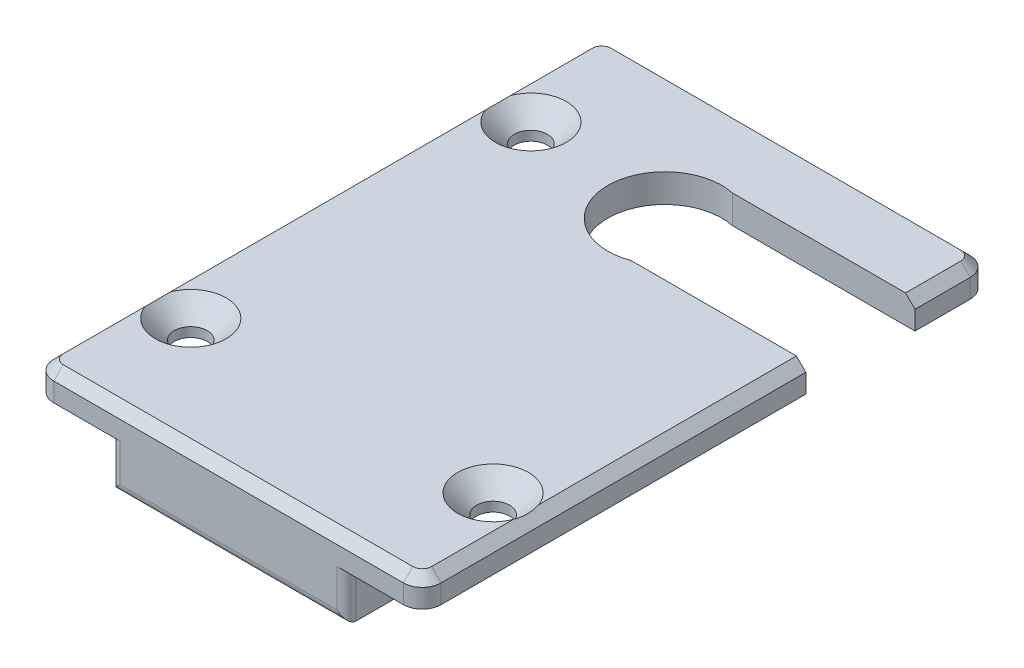
ISO-10303-21;
HEADER;
FILE_DESCRIPTION(('STEP AP214'),'2;1');
FILE_NAME('part.step','',(''),(''),'','','');
FILE_SCHEMA(('AUTOMOTIVE_DESIGN { 1 0 10303 214 1 1 1 1 }'));
ENDSEC;
DATA;
#1=APPLICATION_CONTEXT('core data for automotive mechanical design processes');
#2=APPLICATION_PROTOCOL_DEFINITION('international standard','automotive_design',2000,#1);
#3=PRODUCT_CONTEXT('',#1,'mechanical');
#4=PRODUCT('Part','Part','',(#3));
#5=PRODUCT_RELATED_PRODUCT_CATEGORY('part','',(#4));
#6=PRODUCT_DEFINITION_FORMATION('','',#4);
#7=PRODUCT_DEFINITION_CONTEXT('part definition',#1,'design');
#8=PRODUCT_DEFINITION('design','',#6,#7);
#9=PRODUCT_DEFINITION_SHAPE('','',#8);
#10=(LENGTH_UNIT() NAMED_UNIT(*) SI_UNIT(.MILLI.,.METRE.));
#11=(NAMED_UNIT(*) PLANE_ANGLE_UNIT() SI_UNIT($,.RADIAN.));
#12=(NAMED_UNIT(*) SI_UNIT($,.STERADIAN.) SOLID_ANGLE_UNIT());
#13=UNCERTAINTY_MEASURE_WITH_UNIT(LENGTH_MEASURE(1.E-05),#10,'distance_accuracy_value','');
#14=(GEOMETRIC_REPRESENTATION_CONTEXT(3) GLOBAL_UNCERTAINTY_ASSIGNED_CONTEXT((#13)) GLOBAL_UNIT_ASSIGNED_CONTEXT((#10,
#11,#12)) REPRESENTATION_CONTEXT('',''));
#15=CARTESIAN_POINT('',(0.,0.,0.));
#16=DIRECTION('',(0.,0.,1.));
#17=DIRECTION('',(1.,0.,0.));
#18=AXIS2_PLACEMENT_3D('',#15,#16,#17);
#19=CARTESIAN_POINT('',(20.5,3.,30.));
#20=DIRECTION('',(-1.,0.,0.));
#21=DIRECTION('',(0.,0.,1.));
#22=AXIS2_PLACEMENT_3D('',#19,#20,#21);
#23=PLANE('',#22);
#24=DIRECTION('',(0.,0.,-1.));
#25=VECTOR('',#24,1.);
#26=CARTESIAN_POINT('',(20.5,0.,30.));
#27=LINE('',#26,#25);
#28=CARTESIAN_POINT('',(20.5,0.,28.));
#29=VERTEX_POINT('',#28);
#30=CARTESIAN_POINT('',(20.5,0.,-10.6016995799924));
#31=VERTEX_POINT('',#30);
#32=EDGE_CURVE('E302',#29,#31,#27,.T.);
#33=ORIENTED_EDGE('',*,*,#32,.T.);
#34=DIRECTION('',(0.,1.,0.));
#35=VECTOR('',#34,1.);
#36=CARTESIAN_POINT('',(20.5,3.,-10.6016995799924));
#37=LINE('',#36,#35);
#38=CARTESIAN_POINT('',(20.5,1.99999999999999,-10.6016995799924));
#39=VERTEX_POINT('',#38);
#40=EDGE_CURVE('E251',#31,#39,#37,.T.);
#41=ORIENTED_EDGE('',*,*,#40,.T.);
#42=DIRECTION('',(0.,0.,1.));
#43=VECTOR('',#42,1.);
#44=CARTESIAN_POINT('',(20.5,1.99999999999999,30.));
#45=LINE('',#44,#43);
#46=CARTESIAN_POINT('',(20.5,1.99999999999999,28.));
#47=VERTEX_POINT('',#46);
#48=EDGE_CURVE('E448',#39,#47,#45,.T.);
#49=ORIENTED_EDGE('',*,*,#48,.T.);
#50=DIRECTION('',(0.,-1.,0.));
#51=VECTOR('',#50,1.);
#52=CARTESIAN_POINT('',(20.5,3.,28.));
#53=LINE('',#52,#51);
#54=EDGE_CURVE('E339',#47,#29,#53,.T.);
#55=ORIENTED_EDGE('',*,*,#54,.T.);
#56=EDGE_LOOP('',(#33,#41,#49,#55));
#57=FACE_BOUND('',#56,.T.);
#58=ADVANCED_FACE('F41',(#57),#23,.F.);
#59=CARTESIAN_POINT('',(19.5,3.,0.));
#60=DIRECTION('',(-0.70710678118655,-0.707106781186545,0.));
#61=DIRECTION('',(0.,0.,-1.));
#62=AXIS2_PLACEMENT_3D('',#59,#60,#61);
#63=PLANE('',#62);
#64=DIRECTION('',(-0.707106781186545,0.70710678118655,0.));
#65=VECTOR('',#64,1.);
#66=CARTESIAN_POINT('',(19.5,3.,-10.6016995799924));
#67=LINE('',#66,#65);
#68=CARTESIAN_POINT('',(19.5,3.,-10.6016995799924));
#69=VERTEX_POINT('',#68);
#70=EDGE_CURVE('E52',#69,#39,#67,.F.);
#71=ORIENTED_EDGE('',*,*,#70,.F.);
#72=DIRECTION('',(0.,0.,-1.));
#73=VECTOR('',#72,1.);
#74=CARTESIAN_POINT('',(19.5,3.,0.));
#75=LINE('',#74,#73);
#76=CARTESIAN_POINT('',(19.5,3.,16.6537087982164));
#77=VERTEX_POINT('',#76);
#78=EDGE_CURVE('E401',#77,#69,#75,.T.);
#79=ORIENTED_EDGE('',*,*,#78,.F.);
#80=CARTESIAN_POINT('',(19.5,3.,16.6537087982164));
#81=CARTESIAN_POINT('',(19.5136395829137,2.98636041708632,16.7271557247768));
#82=CARTESIAN_POINT('',(19.5262319038294,2.9737680961706,16.8009847575149));
#83=CARTESIAN_POINT('',(19.5492470662032,2.95075293379682,16.9493241816484));
#84=CARTESIAN_POINT('',(19.5596696628604,2.94033033713958,17.0238346489383));
#85=CARTESIAN_POINT('',(19.5875719343792,2.91242806562079,17.2482855541465));
#86=CARTESIAN_POINT('',(19.6016774869704,2.89832251302957,17.3990995671171));
#87=CARTESIAN_POINT('',(19.620246658516,2.87975334148401,17.698564488858));
#88=CARTESIAN_POINT('',(19.6249145973038,2.87508540269624,17.8471904738007));
#89=CARTESIAN_POINT('',(19.6250829605765,2.87491703942347,18.1443923528261));
#90=CARTESIAN_POINT('',(19.6205886391022,2.8794113608978,18.2929682267787));
#91=CARTESIAN_POINT('',(19.6069708195754,2.8930291804246,18.5169258839211));
#92=CARTESIAN_POINT('',(19.6011644134379,2.89883558656207,18.5927412381178));
#93=CARTESIAN_POINT('',(19.5872252455234,2.91277475447664,18.7439337010953));
#94=CARTESIAN_POINT('',(19.5790928010897,2.92090719891032,18.8193108682281));
#95=CARTESIAN_POINT('',(19.5510921202727,2.94890787972734,19.0463221433284));
#96=CARTESIAN_POINT('',(19.5277272002364,2.97227279976361,19.1971114573755));
#97=CARTESIAN_POINT('',(19.5,3.,19.3462912017836));
#98=B_SPLINE_CURVE_WITH_KNOTS('',3,(#80,#81,#82,#83,#84,#85,#86,#87,#88,#89,#90,#91,#92,#93,#94,
#95,#96,#97),.UNSPECIFIED.,.F.,.F.,(4,2,2,2,2,2,2,2,4),(0.,0.227782292764961,0.455590271332598,
0.911348314212516,1.3571289603666,1.80265404831174,2.03136826305219,2.26005128898759,
2.72259270099148),.UNSPECIFIED.);
#99=CARTESIAN_POINT('',(19.5,3.,19.3462912017836));
#100=VERTEX_POINT('',#99);
#101=EDGE_CURVE('E66',#77,#100,#98,.T.);
#102=ORIENTED_EDGE('',*,*,#101,.T.);
#103=CARTESIAN_POINT('',(19.5,3.,28.));
#104=VERTEX_POINT('',#103);
#105=EDGE_CURVE('E396',#104,#100,#75,.T.);
#106=ORIENTED_EDGE('',*,*,#105,.F.);
#107=DIRECTION('',(0.707106781186545,-0.70710678118655,0.));
#108=VECTOR('',#107,1.);
#109=CARTESIAN_POINT('',(19.5,3.,28.));
#110=LINE('',#109,#108);
#111=EDGE_CURVE('E471',#104,#47,#110,.T.);
#112=ORIENTED_EDGE('',*,*,#111,.T.);
#113=ORIENTED_EDGE('',*,*,#48,.F.);
#114=EDGE_LOOP('',(#71,#79,#102,#106,#112,#113));
#115=FACE_BOUND('',#114,.T.);
#116=ADVANCED_FACE('F534',(#115),#63,.F.);
#117=CARTESIAN_POINT('',(20.5,1.99999999999999,-28.));
#118=VERTEX_POINT('',#117);
#119=CARTESIAN_POINT('',(20.5,1.99999999999999,-22.1574926307751));
#120=VERTEX_POINT('',#119);
#121=EDGE_CURVE('E449',#118,#120,#45,.T.);
#122=ORIENTED_EDGE('',*,*,#121,.T.);
#123=DIRECTION('',(0.,-1.,0.));
#124=VECTOR('',#123,1.);
#125=CARTESIAN_POINT('',(20.5,3.,-22.1574926307751));
#126=LINE('',#125,#124);
#127=CARTESIAN_POINT('',(20.5,0.,-22.1574926307751));
#128=VERTEX_POINT('',#127);
#129=EDGE_CURVE('E59',#120,#128,#126,.T.);
#130=ORIENTED_EDGE('',*,*,#129,.T.);
#131=CARTESIAN_POINT('',(20.5,0.,-28.));
#132=VERTEX_POINT('',#131);
#133=EDGE_CURVE('E294',#128,#132,#27,.T.);
#134=ORIENTED_EDGE('',*,*,#133,.T.);
#135=DIRECTION('',(0.,-1.,0.));
#136=VECTOR('',#135,1.);
#137=CARTESIAN_POINT('',(20.5,3.,-28.));
#138=LINE('',#137,#136);
#139=EDGE_CURVE('E342',#132,#118,#138,.F.);
#140=ORIENTED_EDGE('',*,*,#139,.T.);
#141=EDGE_LOOP('',(#122,#130,#134,#140));
#142=FACE_BOUND('',#141,.T.);
#143=ADVANCED_FACE('F582',(#142),#23,.F.);
#144=CARTESIAN_POINT('',(-20.5,3.,-30.));
#145=DIRECTION('',(0.,0.,1.));
#146=DIRECTION('',(1.,0.,0.));
#147=AXIS2_PLACEMENT_3D('',#144,#145,#146);
#148=PLANE('',#147);
#149=DIRECTION('',(0.,-1.,0.));
#150=VECTOR('',#149,1.);
#151=CARTESIAN_POINT('',(-18.5,3.,-30.));
#152=LINE('',#151,#150);
#153=CARTESIAN_POINT('',(-18.5,0.,-30.));
#154=VERTEX_POINT('',#153);
#155=CARTESIAN_POINT('',(-18.5,1.99999999999999,-30.));
#156=VERTEX_POINT('',#155);
#157=EDGE_CURVE('E318',#154,#156,#152,.F.);
#158=ORIENTED_EDGE('',*,*,#157,.T.);
#159=DIRECTION('',(1.,0.,0.));
#160=VECTOR('',#159,1.);
#161=CARTESIAN_POINT('',(-20.5,2.00000000000001,-30.));
#162=LINE('',#161,#160);
#163=CARTESIAN_POINT('',(18.5,1.99999999999999,-30.));
#164=VERTEX_POINT('',#163);
#165=EDGE_CURVE('E426',#156,#164,#162,.T.);
#166=ORIENTED_EDGE('',*,*,#165,.T.);
#167=DIRECTION('',(0.,-1.,0.));
#168=VECTOR('',#167,1.);
#169=CARTESIAN_POINT('',(18.5,3.,-30.));
#170=LINE('',#169,#168);
#171=CARTESIAN_POINT('',(18.5,0.,-30.));
#172=VERTEX_POINT('',#171);
#173=EDGE_CURVE('E322',#164,#172,#170,.T.);
#174=ORIENTED_EDGE('',*,*,#173,.T.);
#175=DIRECTION('',(-1.,0.,0.));
#176=VECTOR('',#175,1.);
#177=CARTESIAN_POINT('',(-20.5,0.,-30.));
#178=LINE('',#177,#176);
#179=EDGE_CURVE('E306',#172,#154,#178,.T.);
#180=ORIENTED_EDGE('',*,*,#179,.T.);
#181=EDGE_LOOP('',(#158,#166,#174,#180));
#182=FACE_BOUND('',#181,.T.);
#183=ADVANCED_FACE('F590',(#182),#148,.F.);
#184=CARTESIAN_POINT('',(-20.5,3.,30.));
#185=DIRECTION('',(1.,0.,0.));
#186=DIRECTION('',(0.,0.,-1.));
#187=AXIS2_PLACEMENT_3D('',#184,#185,#186);
#188=PLANE('',#187);
#189=DIRECTION('',(0.,-1.,0.));
#190=VECTOR('',#189,1.);
#191=CARTESIAN_POINT('',(-20.5,3.,28.));
#192=LINE('',#191,#190);
#193=CARTESIAN_POINT('',(-20.5,0.,28.));
#194=VERTEX_POINT('',#193);
#195=CARTESIAN_POINT('',(-20.5,1.99999999999999,28.));
#196=VERTEX_POINT('',#195);
#197=EDGE_CURVE('E346',#194,#196,#192,.F.);
#198=ORIENTED_EDGE('',*,*,#197,.T.);
#199=DIRECTION('',(0.,0.,-1.));
#200=VECTOR('',#199,1.);
#201=CARTESIAN_POINT('',(-20.5,1.99999999999999,30.));
#202=LINE('',#201,#200);
#203=CARTESIAN_POINT('',(-20.5,1.99999999999999,-28.));
#204=VERTEX_POINT('',#203);
#205=EDGE_CURVE('E430',#196,#204,#202,.T.);
#206=ORIENTED_EDGE('',*,*,#205,.T.);
#207=DIRECTION('',(0.,-1.,0.));
#208=VECTOR('',#207,1.);
#209=CARTESIAN_POINT('',(-20.5,3.,-28.));
#210=LINE('',#209,#208);
#211=CARTESIAN_POINT('',(-20.5,0.,-28.));
#212=VERTEX_POINT('',#211);
#213=EDGE_CURVE('E350',#204,#212,#210,.T.);
#214=ORIENTED_EDGE('',*,*,#213,.T.);
#215=DIRECTION('',(0.,0.,1.));
#216=VECTOR('',#215,1.);
#217=CARTESIAN_POINT('',(-20.5,0.,30.));
#218=LINE('',#217,#216);
#219=EDGE_CURVE('E310',#212,#194,#218,.T.);
#220=ORIENTED_EDGE('',*,*,#219,.T.);
#221=EDGE_LOOP('',(#198,#206,#214,#220));
#222=FACE_BOUND('',#221,.T.);
#223=ADVANCED_FACE('F595',(#222),#188,.F.);
#224=CARTESIAN_POINT('',(-20.5,3.,30.));
#225=DIRECTION('',(0.,0.,-1.));
#226=DIRECTION('',(-1.,0.,0.));
#227=AXIS2_PLACEMENT_3D('',#224,#225,#226);
#228=PLANE('',#227);
#229=DIRECTION('',(0.,-1.,0.));
#230=VECTOR('',#229,1.);
#231=CARTESIAN_POINT('',(18.5,3.,30.));
#232=LINE('',#231,#230);
#233=CARTESIAN_POINT('',(18.5,0.,30.));
#234=VERTEX_POINT('',#233);
#235=CARTESIAN_POINT('',(18.5,1.99999999999999,30.));
#236=VERTEX_POINT('',#235);
#237=EDGE_CURVE('E353',#234,#236,#232,.F.);
#238=ORIENTED_EDGE('',*,*,#237,.T.);
#239=DIRECTION('',(-1.,0.,0.));
#240=VECTOR('',#239,1.);
#241=CARTESIAN_POINT('',(-20.5,1.99999999999999,30.));
#242=LINE('',#241,#240);
#243=CARTESIAN_POINT('',(-18.5,1.99999999999999,30.));
#244=VERTEX_POINT('',#243);
#245=EDGE_CURVE('E439',#236,#244,#242,.T.);
#246=ORIENTED_EDGE('',*,*,#245,.T.);
#247=DIRECTION('',(0.,-1.,0.));
#248=VECTOR('',#247,1.);
#249=CARTESIAN_POINT('',(-18.5,3.,30.));
#250=LINE('',#249,#248);
#251=CARTESIAN_POINT('',(-18.5,0.,30.));
#252=VERTEX_POINT('',#251);
#253=EDGE_CURVE('E357',#244,#252,#250,.T.);
#254=ORIENTED_EDGE('',*,*,#253,.T.);
#255=DIRECTION('',(1.,0.,0.));
#256=VECTOR('',#255,1.);
#257=CARTESIAN_POINT('',(-20.5,0.,30.));
#258=LINE('',#257,#256);
#259=CARTESIAN_POINT('',(-11.5,0.,30.));
#260=VERTEX_POINT('',#259);
#261=EDGE_CURVE('E315',#252,#260,#258,.T.);
#262=ORIENTED_EDGE('',*,*,#261,.T.);
#263=DIRECTION('',(0.,1.,0.));
#264=VECTOR('',#263,1.);
#265=CARTESIAN_POINT('',(-11.5,3.,30.));
#266=LINE('',#265,#264);
#267=CARTESIAN_POINT('',(-11.5,-4.,30.));
#268=VERTEX_POINT('',#267);
#269=EDGE_CURVE('E371',#260,#268,#266,.F.);
#270=ORIENTED_EDGE('',*,*,#269,.T.);
#271=DIRECTION('',(-1.,0.,0.));
#272=VECTOR('',#271,1.);
#273=CARTESIAN_POINT('',(-20.5,-4.,30.));
#274=LINE('',#273,#272);
#275=CARTESIAN_POINT('',(11.5,-4.,30.));
#276=VERTEX_POINT('',#275);
#277=EDGE_CURVE('E368',#268,#276,#274,.F.);
#278=ORIENTED_EDGE('',*,*,#277,.T.);
#279=DIRECTION('',(0.,1.,0.));
#280=VECTOR('',#279,1.);
#281=CARTESIAN_POINT('',(11.5,3.,30.));
#282=LINE('',#281,#280);
#283=CARTESIAN_POINT('',(11.5,0.,30.));
#284=VERTEX_POINT('',#283);
#285=EDGE_CURVE('E364',#276,#284,#282,.T.);
#286=ORIENTED_EDGE('',*,*,#285,.T.);
#287=EDGE_CURVE('E314',#284,#234,#258,.T.);
#288=ORIENTED_EDGE('',*,*,#287,.T.);
#289=EDGE_LOOP('',(#238,#246,#254,#262,#270,#278,#286,#288));
#290=FACE_BOUND('',#289,.T.);
#291=ADVANCED_FACE('F674',(#290),#228,.F.);
#292=CARTESIAN_POINT('',(0.,3.,0.));
#293=DIRECTION('',(0.,-1.,0.));
#294=DIRECTION('',(0.,0.,-1.));
#295=AXIS2_PLACEMENT_3D('',#292,#293,#294);
#296=PLANE('',#295);
#297=ORIENTED_EDGE('',*,*,#78,.T.);
#298=DIRECTION('',(1.,0.,0.));
#299=VECTOR('',#298,1.);
#300=CARTESIAN_POINT('',(23.4185968881252,3.,-10.6016995799924));
#301=LINE('',#300,#299);
#302=CARTESIAN_POINT('',(2.02351344164301,3.,-10.6016995799924));
#303=VERTEX_POINT('',#302);
#304=EDGE_CURVE('E227',#303,#69,#301,.T.);
#305=ORIENTED_EDGE('',*,*,#304,.F.);
#306=CARTESIAN_POINT('',(-0.0812731172144571,3.,-16.2575493955439));
#307=DIRECTION('',(0.,1.,0.));
#308=DIRECTION('',(0.,0.,1.));
#309=AXIS2_PLACEMENT_3D('',#306,#307,#308);
#310=CIRCLE('',#309,6.03479606900029);
#311=CARTESIAN_POINT('',(1.1873613516026,3.,-22.1574926307751));
#312=VERTEX_POINT('',#311);
#313=EDGE_CURVE('E221',#312,#303,#310,.T.);
#314=ORIENTED_EDGE('',*,*,#313,.F.);
#315=DIRECTION('',(-1.,0.,0.));
#316=VECTOR('',#315,1.);
#317=CARTESIAN_POINT('',(23.4185968881252,3.,-22.1574926307751));
#318=LINE('',#317,#316);
#319=CARTESIAN_POINT('',(19.5,3.,-22.1574926307751));
#320=VERTEX_POINT('',#319);
#321=EDGE_CURVE('E230',#320,#312,#318,.T.);
#322=ORIENTED_EDGE('',*,*,#321,.F.);
#323=CARTESIAN_POINT('',(19.5,3.,-28.));
#324=VERTEX_POINT('',#323);
#325=EDGE_CURVE('E387',#320,#324,#75,.T.);
#326=ORIENTED_EDGE('',*,*,#325,.T.);
#327=CARTESIAN_POINT('',(18.5,3.,-28.));
#328=DIRECTION('',(0.,-1.,0.));
#329=DIRECTION('',(0.,0.,-1.));
#330=AXIS2_PLACEMENT_3D('',#327,#328,#329);
#331=CIRCLE('',#330,1.);
#332=CARTESIAN_POINT('',(18.5,3.,-29.));
#333=VERTEX_POINT('',#332);
#334=EDGE_CURVE('E400',#324,#333,#331,.F.);
#335=ORIENTED_EDGE('',*,*,#334,.T.);
#336=DIRECTION('',(-1.,0.,0.));
#337=VECTOR('',#336,1.);
#338=CARTESIAN_POINT('',(0.,3.,-29.));
#339=LINE('',#338,#337);
#340=CARTESIAN_POINT('',(-18.5,3.,-29.));
#341=VERTEX_POINT('',#340);
#342=EDGE_CURVE('E418',#333,#341,#339,.T.);
#343=ORIENTED_EDGE('',*,*,#342,.T.);
#344=CARTESIAN_POINT('',(-18.5,3.,-28.));
#345=DIRECTION('',(0.,-1.,0.));
#346=DIRECTION('',(0.,0.,-1.));
#347=AXIS2_PLACEMENT_3D('',#344,#345,#346);
#348=CIRCLE('',#347,0.999999999999997);
#349=CARTESIAN_POINT('',(-19.5,3.,-28.));
#350=VERTEX_POINT('',#349);
#351=EDGE_CURVE('E423',#341,#350,#348,.F.);
#352=ORIENTED_EDGE('',*,*,#351,.T.);
#353=DIRECTION('',(0.,0.,1.));
#354=VECTOR('',#353,1.);
#355=CARTESIAN_POINT('',(-19.5,3.,0.));
#356=LINE('',#355,#354);
#357=CARTESIAN_POINT('',(-19.5,3.,-19.3462912017837));
#358=VERTEX_POINT('',#357);
#359=EDGE_CURVE('E414',#350,#358,#356,.T.);
#360=ORIENTED_EDGE('',*,*,#359,.T.);
#361=CARTESIAN_POINT('',(-16.,3.,-18.));
#362=DIRECTION('',(0.,-1.,0.));
#363=DIRECTION('',(0.,0.,-1.));
#364=AXIS2_PLACEMENT_3D('',#361,#362,#363);
#365=CIRCLE('',#364,3.75000000000002);
#366=CARTESIAN_POINT('',(-19.5,3.,-16.6537087982163));
#367=VERTEX_POINT('',#366);
#368=EDGE_CURVE('E485',#358,#367,#365,.T.);
#369=ORIENTED_EDGE('',*,*,#368,.T.);
#370=CARTESIAN_POINT('',(-19.5,3.,16.6537087982163));
#371=VERTEX_POINT('',#370);
#372=EDGE_CURVE('E419',#367,#371,#356,.T.);
#373=ORIENTED_EDGE('',*,*,#372,.T.);
#374=CARTESIAN_POINT('',(-16.,3.,18.));
#375=DIRECTION('',(0.,-1.,0.));
#376=DIRECTION('',(0.,0.,-1.));
#377=AXIS2_PLACEMENT_3D('',#374,#375,#376);
#378=CIRCLE('',#377,3.75000000000002);
#379=CARTESIAN_POINT('',(-19.5,3.,19.3462912017837));
#380=VERTEX_POINT('',#379);
#381=EDGE_CURVE('E492',#371,#380,#378,.T.);
#382=ORIENTED_EDGE('',*,*,#381,.T.);
#383=CARTESIAN_POINT('',(-19.5,3.,28.));
#384=VERTEX_POINT('',#383);
#385=EDGE_CURVE('E413',#380,#384,#356,.T.);
#386=ORIENTED_EDGE('',*,*,#385,.T.);
#387=CARTESIAN_POINT('',(-18.5,3.,28.));
#388=DIRECTION('',(0.,-1.,0.));
#389=DIRECTION('',(0.,0.,-1.));
#390=AXIS2_PLACEMENT_3D('',#387,#388,#389);
#391=CIRCLE('',#390,1.);
#392=CARTESIAN_POINT('',(-18.5,3.,29.));
#393=VERTEX_POINT('',#392);
#394=EDGE_CURVE('E410',#384,#393,#391,.F.);
#395=ORIENTED_EDGE('',*,*,#394,.T.);
#396=DIRECTION('',(1.,0.,0.));
#397=VECTOR('',#396,1.);
#398=CARTESIAN_POINT('',(0.,3.,29.));
#399=LINE('',#398,#397);
#400=CARTESIAN_POINT('',(18.5,3.,29.));
#401=VERTEX_POINT('',#400);
#402=EDGE_CURVE('E407',#393,#401,#399,.T.);
#403=ORIENTED_EDGE('',*,*,#402,.T.);
#404=CARTESIAN_POINT('',(18.5,3.,28.));
#405=DIRECTION('',(0.,-1.,0.));
#406=DIRECTION('',(0.,0.,-1.));
#407=AXIS2_PLACEMENT_3D('',#404,#405,#406);
#408=CIRCLE('',#407,0.999999999999997);
#409=EDGE_CURVE('E404',#401,#104,#408,.F.);
#410=ORIENTED_EDGE('',*,*,#409,.T.);
#411=ORIENTED_EDGE('',*,*,#105,.T.);
#412=CARTESIAN_POINT('',(16.,3.,18.));
#413=DIRECTION('',(0.,-1.,0.));
#414=DIRECTION('',(0.,0.,-1.));
#415=AXIS2_PLACEMENT_3D('',#412,#413,#414);
#416=CIRCLE('',#415,3.75000000000001);
#417=EDGE_CURVE('E489',#100,#77,#416,.T.);
#418=ORIENTED_EDGE('',*,*,#417,.T.);
#419=EDGE_LOOP('',(#297,#305,#314,#322,#326,#335,#343,#352,#360,#369,#373,#382,#386,#395,#403,
#410,#411,#418));
#420=FACE_BOUND('',#419,.T.);
#421=ADVANCED_FACE('F238',(#420),#296,.F.);
#422=CARTESIAN_POINT('',(0.,0.,0.));
#423=DIRECTION('',(0.,-1.,0.));
#424=DIRECTION('',(0.,0.,-1.));
#425=AXIS2_PLACEMENT_3D('',#422,#423,#424);
#426=PLANE('',#425);
#427=DIRECTION('',(-1.,0.,0.));
#428=VECTOR('',#427,1.);
#429=CARTESIAN_POINT('',(0.,0.,-10.6016995799924));
#430=LINE('',#429,#428);
#431=CARTESIAN_POINT('',(2.02351344164301,0.,-10.6016995799924));
#432=VERTEX_POINT('',#431);
#433=EDGE_CURVE('E255',#31,#432,#430,.T.);
#434=ORIENTED_EDGE('',*,*,#433,.F.);
#435=ORIENTED_EDGE('',*,*,#32,.F.);
#436=CARTESIAN_POINT('',(18.5,0.,28.));
#437=DIRECTION('',(0.,-1.,0.));
#438=DIRECTION('',(0.,0.,-1.));
#439=AXIS2_PLACEMENT_3D('',#436,#437,#438);
#440=CIRCLE('',#439,2.);
#441=EDGE_CURVE('E325',#29,#234,#440,.T.);
#442=ORIENTED_EDGE('',*,*,#441,.T.);
#443=ORIENTED_EDGE('',*,*,#287,.F.);
#444=CARTESIAN_POINT('',(11.5,0.,29.));
#445=DIRECTION('',(0.,-1.,0.));
#446=DIRECTION('',(0.,0.,-1.));
#447=AXIS2_PLACEMENT_3D('',#444,#445,#446);
#448=CIRCLE('',#447,1.);
#449=CARTESIAN_POINT('',(12.5,0.,29.));
#450=VERTEX_POINT('',#449);
#451=EDGE_CURVE('E384',#284,#450,#448,.F.);
#452=ORIENTED_EDGE('',*,*,#451,.T.);
#453=DIRECTION('',(0.,0.,1.));
#454=VECTOR('',#453,1.);
#455=CARTESIAN_POINT('',(12.5,0.,22.));
#456=LINE('',#455,#454);
#457=CARTESIAN_POINT('',(12.5,0.,22.));
#458=VERTEX_POINT('',#457);
#459=EDGE_CURVE('E271',#458,#450,#456,.T.);
#460=ORIENTED_EDGE('',*,*,#459,.F.);
#461=DIRECTION('',(1.,0.,0.));
#462=VECTOR('',#461,1.);
#463=CARTESIAN_POINT('',(-12.5,0.,22.));
#464=LINE('',#463,#462);
#465=CARTESIAN_POINT('',(-12.5,0.,22.));
#466=VERTEX_POINT('',#465);
#467=EDGE_CURVE('E264',#466,#458,#464,.T.);
#468=ORIENTED_EDGE('',*,*,#467,.F.);
#469=DIRECTION('',(0.,0.,-1.));
#470=VECTOR('',#469,1.);
#471=CARTESIAN_POINT('',(-12.5,0.,22.));
#472=LINE('',#471,#470);
#473=CARTESIAN_POINT('',(-12.5,0.,29.));
#474=VERTEX_POINT('',#473);
#475=EDGE_CURVE('E275',#474,#466,#472,.T.);
#476=ORIENTED_EDGE('',*,*,#475,.F.);
#477=CARTESIAN_POINT('',(-11.5,0.,29.));
#478=DIRECTION('',(0.,-1.,0.));
#479=DIRECTION('',(0.,0.,-1.));
#480=AXIS2_PLACEMENT_3D('',#477,#478,#479);
#481=CIRCLE('',#480,1.);
#482=EDGE_CURVE('E380',#474,#260,#481,.F.);
#483=ORIENTED_EDGE('',*,*,#482,.T.);
#484=ORIENTED_EDGE('',*,*,#261,.F.);
#485=CARTESIAN_POINT('',(-18.5,0.,28.));
#486=DIRECTION('',(0.,-1.,0.));
#487=DIRECTION('',(0.,0.,-1.));
#488=AXIS2_PLACEMENT_3D('',#485,#486,#487);
#489=CIRCLE('',#488,2.);
#490=EDGE_CURVE('E329',#252,#194,#489,.T.);
#491=ORIENTED_EDGE('',*,*,#490,.T.);
#492=ORIENTED_EDGE('',*,*,#219,.F.);
#493=CARTESIAN_POINT('',(-18.5,0.,-28.));
#494=DIRECTION('',(0.,-1.,0.));
#495=DIRECTION('',(0.,0.,-1.));
#496=AXIS2_PLACEMENT_3D('',#493,#494,#495);
#497=CIRCLE('',#496,2.);
#498=EDGE_CURVE('E332',#212,#154,#497,.T.);
#499=ORIENTED_EDGE('',*,*,#498,.T.);
#500=ORIENTED_EDGE('',*,*,#179,.F.);
#501=CARTESIAN_POINT('',(18.5,0.,-28.));
#502=DIRECTION('',(0.,-1.,0.));
#503=DIRECTION('',(0.,0.,-1.));
#504=AXIS2_PLACEMENT_3D('',#501,#502,#503);
#505=CIRCLE('',#504,2.);
#506=EDGE_CURVE('E335',#172,#132,#505,.T.);
#507=ORIENTED_EDGE('',*,*,#506,.T.);
#508=ORIENTED_EDGE('',*,*,#133,.F.);
#509=DIRECTION('',(1.,0.,0.));
#510=VECTOR('',#509,1.);
#511=CARTESIAN_POINT('',(0.,0.,-22.1574926307751));
#512=LINE('',#511,#510);
#513=CARTESIAN_POINT('',(1.1873613516026,0.,-22.1574926307751));
#514=VERTEX_POINT('',#513);
#515=EDGE_CURVE('E248',#514,#128,#512,.T.);
#516=ORIENTED_EDGE('',*,*,#515,.F.);
#517=CARTESIAN_POINT('',(-0.0812731172144571,0.,-16.2575493955439));
#518=DIRECTION('',(0.,-1.,0.));
#519=DIRECTION('',(0.,0.,-1.));
#520=AXIS2_PLACEMENT_3D('',#517,#518,#519);
#521=CIRCLE('',#520,6.03479606900029);
#522=EDGE_CURVE('E11',#432,#514,#521,.T.);
#523=ORIENTED_EDGE('',*,*,#522,.F.);
#524=EDGE_LOOP('',(#434,#435,#442,#443,#452,#460,#468,#476,#483,#484,#491,#492,#499,#500,#507,
#508,#516,#523));
#525=FACE_BOUND('',#524,.T.);
#526=CARTESIAN_POINT('',(-16.,0.,-18.));
#527=DIRECTION('',(0.,1.,0.));
#528=DIRECTION('',(0.,0.,-1.));
#529=AXIS2_PLACEMENT_3D('',#526,#527,#528);
#530=CIRCLE('',#529,1.75);
#531=CARTESIAN_POINT('',(-16.,0.,-19.75));
#532=VERTEX_POINT('',#531);
#533=EDGE_CURVE('E289',#532,#532,#530,.T.);
#534=ORIENTED_EDGE('',*,*,#533,.T.);
#535=EDGE_LOOP('',(#534));
#536=FACE_BOUND('',#535,.T.);
#537=CARTESIAN_POINT('',(-16.,0.,18.));
#538=DIRECTION('',(0.,1.,0.));
#539=DIRECTION('',(0.,0.,1.));
#540=AXIS2_PLACEMENT_3D('',#537,#538,#539);
#541=CIRCLE('',#540,1.75);
#542=CARTESIAN_POINT('',(-16.,0.,19.75));
#543=VERTEX_POINT('',#542);
#544=EDGE_CURVE('E295',#543,#543,#541,.T.);
#545=ORIENTED_EDGE('',*,*,#544,.T.);
#546=EDGE_LOOP('',(#545));
#547=FACE_BOUND('',#546,.T.);
#548=CARTESIAN_POINT('',(16.,0.,18.));
#549=DIRECTION('',(0.,1.,0.));
#550=DIRECTION('',(0.,0.,-1.));
#551=AXIS2_PLACEMENT_3D('',#548,#549,#550);
#552=CIRCLE('',#551,1.75);
#553=CARTESIAN_POINT('',(16.,0.,16.25));
#554=VERTEX_POINT('',#553);
#555=EDGE_CURVE('E290',#554,#554,#552,.T.);
#556=ORIENTED_EDGE('',*,*,#555,.T.);
#557=EDGE_LOOP('',(#556));
#558=FACE_BOUND('',#557,.T.);
#559=ADVANCED_FACE('F656',(#525,#536,#547,#558),#426,.T.);
#560=CARTESIAN_POINT('',(16.,0.,18.));
#561=DIRECTION('',(0.,1.,0.));
#562=DIRECTION('',(0.,0.,1.));
#563=AXIS2_PLACEMENT_3D('',#560,#561,#562);
#564=CYLINDRICAL_SURFACE('',#563,1.75);
#565=CARTESIAN_POINT('',(16.,1.,18.));
#566=DIRECTION('',(0.,-1.,0.));
#567=DIRECTION('',(0.,0.,-1.));
#568=AXIS2_PLACEMENT_3D('',#565,#566,#567);
#569=CIRCLE('',#568,1.75);
#570=CARTESIAN_POINT('',(16.,1.,16.25));
#571=VERTEX_POINT('',#570);
#572=EDGE_CURVE('E544',#571,#571,#569,.F.);
#573=ORIENTED_EDGE('',*,*,#572,.T.);
#574=EDGE_LOOP('',(#573));
#575=FACE_BOUND('',#574,.T.);
#576=ORIENTED_EDGE('',*,*,#555,.F.);
#577=EDGE_LOOP('',(#576));
#578=FACE_BOUND('',#577,.T.);
#579=ADVANCED_FACE('F685',(#575,#578),#564,.F.);
#580=CARTESIAN_POINT('',(-16.,0.,18.));
#581=DIRECTION('',(0.,1.,0.));
#582=DIRECTION('',(0.,0.,1.));
#583=AXIS2_PLACEMENT_3D('',#580,#581,#582);
#584=CYLINDRICAL_SURFACE('',#583,1.75);
#585=CARTESIAN_POINT('',(-16.,0.999999999999992,18.));
#586=DIRECTION('',(0.,-1.,0.));
#587=DIRECTION('',(0.,0.,-1.));
#588=AXIS2_PLACEMENT_3D('',#585,#586,#587);
#589=CIRCLE('',#588,1.75);
#590=CARTESIAN_POINT('',(-16.,0.999999999999992,16.25));
#591=VERTEX_POINT('',#590);
#592=EDGE_CURVE('E453',#591,#591,#589,.F.);
#593=ORIENTED_EDGE('',*,*,#592,.T.);
#594=EDGE_LOOP('',(#593));
#595=FACE_BOUND('',#594,.T.);
#596=ORIENTED_EDGE('',*,*,#544,.F.);
#597=EDGE_LOOP('',(#596));
#598=FACE_BOUND('',#597,.T.);
#599=ADVANCED_FACE('F689',(#595,#598),#584,.F.);
#600=CARTESIAN_POINT('',(-16.,0.,-18.));
#601=DIRECTION('',(0.,1.,0.));
#602=DIRECTION('',(0.,0.,1.));
#603=AXIS2_PLACEMENT_3D('',#600,#601,#602);
#604=CYLINDRICAL_SURFACE('',#603,1.75);
#605=CARTESIAN_POINT('',(-16.,0.999999999999992,-18.));
#606=DIRECTION('',(0.,-1.,0.));
#607=DIRECTION('',(0.,0.,-1.));
#608=AXIS2_PLACEMENT_3D('',#605,#606,#607);
#609=CIRCLE('',#608,1.75);
#610=CARTESIAN_POINT('',(-16.,0.999999999999992,-19.75));
#611=VERTEX_POINT('',#610);
#612=EDGE_CURVE('E543',#611,#611,#609,.F.);
#613=ORIENTED_EDGE('',*,*,#612,.T.);
#614=EDGE_LOOP('',(#613));
#615=FACE_BOUND('',#614,.T.);
#616=ORIENTED_EDGE('',*,*,#533,.F.);
#617=EDGE_LOOP('',(#616));
#618=FACE_BOUND('',#617,.T.);
#619=ADVANCED_FACE('F619',(#615,#618),#604,.F.);
#620=CARTESIAN_POINT('',(18.5,3.,-28.));
#621=DIRECTION('',(0.,-1.,0.));
#622=DIRECTION('',(0.,0.,-1.));
#623=AXIS2_PLACEMENT_3D('',#620,#621,#622);
#624=CYLINDRICAL_SURFACE('',#623,2.);
#625=ORIENTED_EDGE('',*,*,#173,.F.);
#626=CARTESIAN_POINT('',(18.5,1.99999999999999,-28.));
#627=DIRECTION('',(0.,-1.,0.));
#628=DIRECTION('',(0.,0.,-1.));
#629=AXIS2_PLACEMENT_3D('',#626,#627,#628);
#630=CIRCLE('',#629,2.);
#631=EDGE_CURVE('E445',#164,#118,#630,.T.);
#632=ORIENTED_EDGE('',*,*,#631,.T.);
#633=ORIENTED_EDGE('',*,*,#139,.F.);
#634=ORIENTED_EDGE('',*,*,#506,.F.);
#635=EDGE_LOOP('',(#625,#632,#633,#634));
#636=FACE_BOUND('',#635,.T.);
#637=ADVANCED_FACE('F782',(#636),#624,.T.);
#638=CARTESIAN_POINT('',(-18.5,3.,-28.));
#639=DIRECTION('',(0.,-1.,0.));
#640=DIRECTION('',(0.,0.,-1.));
#641=AXIS2_PLACEMENT_3D('',#638,#639,#640);
#642=CYLINDRICAL_SURFACE('',#641,2.);
#643=ORIENTED_EDGE('',*,*,#213,.F.);
#644=CARTESIAN_POINT('',(-18.5,1.99999999999999,-28.));
#645=DIRECTION('',(0.,-1.,0.));
#646=DIRECTION('',(0.,0.,-1.));
#647=AXIS2_PLACEMENT_3D('',#644,#645,#646);
#648=CIRCLE('',#647,2.);
#649=EDGE_CURVE('E436',#204,#156,#648,.T.);
#650=ORIENTED_EDGE('',*,*,#649,.T.);
#651=ORIENTED_EDGE('',*,*,#157,.F.);
#652=ORIENTED_EDGE('',*,*,#498,.F.);
#653=EDGE_LOOP('',(#643,#650,#651,#652));
#654=FACE_BOUND('',#653,.T.);
#655=ADVANCED_FACE('F650',(#654),#642,.T.);
#656=CARTESIAN_POINT('',(-18.5,3.,28.));
#657=DIRECTION('',(0.,-1.,0.));
#658=DIRECTION('',(0.,0.,-1.));
#659=AXIS2_PLACEMENT_3D('',#656,#657,#658);
#660=CYLINDRICAL_SURFACE('',#659,2.);
#661=ORIENTED_EDGE('',*,*,#253,.F.);
#662=CARTESIAN_POINT('',(-18.5,1.99999999999999,28.));
#663=DIRECTION('',(0.,-1.,0.));
#664=DIRECTION('',(0.,0.,-1.));
#665=AXIS2_PLACEMENT_3D('',#662,#663,#664);
#666=CIRCLE('',#665,2.);
#667=EDGE_CURVE('E433',#244,#196,#666,.T.);
#668=ORIENTED_EDGE('',*,*,#667,.T.);
#669=ORIENTED_EDGE('',*,*,#197,.F.);
#670=ORIENTED_EDGE('',*,*,#490,.F.);
#671=EDGE_LOOP('',(#661,#668,#669,#670));
#672=FACE_BOUND('',#671,.T.);
#673=ADVANCED_FACE('F662',(#672),#660,.T.);
#674=CARTESIAN_POINT('',(18.5,3.,28.));
#675=DIRECTION('',(0.,-1.,0.));
#676=DIRECTION('',(0.,0.,-1.));
#677=AXIS2_PLACEMENT_3D('',#674,#675,#676);
#678=CYLINDRICAL_SURFACE('',#677,2.);
#679=ORIENTED_EDGE('',*,*,#54,.F.);
#680=CARTESIAN_POINT('',(18.5,1.99999999999999,28.));
#681=DIRECTION('',(0.,-1.,0.));
#682=DIRECTION('',(0.,0.,-1.));
#683=AXIS2_PLACEMENT_3D('',#680,#681,#682);
#684=CIRCLE('',#683,2.);
#685=EDGE_CURVE('E442',#47,#236,#684,.T.);
#686=ORIENTED_EDGE('',*,*,#685,.T.);
#687=ORIENTED_EDGE('',*,*,#237,.F.);
#688=ORIENTED_EDGE('',*,*,#441,.F.);
#689=EDGE_LOOP('',(#679,#686,#687,#688));
#690=FACE_BOUND('',#689,.T.);
#691=ADVANCED_FACE('F672',(#690),#678,.T.);
#692=CARTESIAN_POINT('',(12.5,-5.,22.));
#693=DIRECTION('',(-1.,0.,0.));
#694=DIRECTION('',(0.,0.,1.));
#695=AXIS2_PLACEMENT_3D('',#692,#693,#694);
#696=PLANE('',#695);
#697=ORIENTED_EDGE('',*,*,#459,.T.);
#698=DIRECTION('',(0.,1.,0.));
#699=VECTOR('',#698,1.);
#700=CARTESIAN_POINT('',(12.5,-5.,29.));
#701=LINE('',#700,#699);
#702=CARTESIAN_POINT('',(12.5,-5.,29.));
#703=VERTEX_POINT('',#702);
#704=EDGE_CURVE('E377',#450,#703,#701,.F.);
#705=ORIENTED_EDGE('',*,*,#704,.T.);
#706=DIRECTION('',(0.,0.,1.));
#707=VECTOR('',#706,1.);
#708=CARTESIAN_POINT('',(12.5,-5.,22.));
#709=LINE('',#708,#707);
#710=CARTESIAN_POINT('',(12.5,-5.,22.));
#711=VERTEX_POINT('',#710);
#712=EDGE_CURVE('E259',#711,#703,#709,.T.);
#713=ORIENTED_EDGE('',*,*,#712,.F.);
#714=DIRECTION('',(0.,1.,0.));
#715=VECTOR('',#714,1.);
#716=CARTESIAN_POINT('',(12.5,-5.,22.));
#717=LINE('',#716,#715);
#718=EDGE_CURVE('E270',#711,#458,#717,.T.);
#719=ORIENTED_EDGE('',*,*,#718,.T.);
#720=EDGE_LOOP('',(#697,#705,#713,#719));
#721=FACE_BOUND('',#720,.T.);
#722=ADVANCED_FACE('F774',(#721),#696,.F.);
#723=CARTESIAN_POINT('',(-12.5,-5.,22.));
#724=DIRECTION('',(1.,0.,0.));
#725=DIRECTION('',(0.,0.,-1.));
#726=AXIS2_PLACEMENT_3D('',#723,#724,#725);
#727=PLANE('',#726);
#728=DIRECTION('',(0.,0.,-1.));
#729=VECTOR('',#728,1.);
#730=CARTESIAN_POINT('',(-12.5,-5.,22.));
#731=LINE('',#730,#729);
#732=CARTESIAN_POINT('',(-12.5,-5.,29.));
#733=VERTEX_POINT('',#732);
#734=CARTESIAN_POINT('',(-12.5,-5.,22.));
#735=VERTEX_POINT('',#734);
#736=EDGE_CURVE('E263',#733,#735,#731,.T.);
#737=ORIENTED_EDGE('',*,*,#736,.F.);
#738=DIRECTION('',(0.,1.,0.));
#739=VECTOR('',#738,1.);
#740=CARTESIAN_POINT('',(-12.5,-5.,29.));
#741=LINE('',#740,#739);
#742=EDGE_CURVE('E360',#733,#474,#741,.T.);
#743=ORIENTED_EDGE('',*,*,#742,.T.);
#744=ORIENTED_EDGE('',*,*,#475,.T.);
#745=DIRECTION('',(0.,1.,0.));
#746=VECTOR('',#745,1.);
#747=CARTESIAN_POINT('',(-12.5,-5.,22.));
#748=LINE('',#747,#746);
#749=EDGE_CURVE('E285',#735,#466,#748,.T.);
#750=ORIENTED_EDGE('',*,*,#749,.F.);
#751=EDGE_LOOP('',(#737,#743,#744,#750));
#752=FACE_BOUND('',#751,.T.);
#753=ADVANCED_FACE('F770',(#752),#727,.F.);
#754=CARTESIAN_POINT('',(-12.5,-5.,22.));
#755=DIRECTION('',(0.,0.,1.));
#756=DIRECTION('',(1.,0.,0.));
#757=AXIS2_PLACEMENT_3D('',#754,#755,#756);
#758=PLANE('',#757);
#759=ORIENTED_EDGE('',*,*,#467,.T.);
#760=ORIENTED_EDGE('',*,*,#718,.F.);
#761=DIRECTION('',(1.,0.,0.));
#762=VECTOR('',#761,1.);
#763=CARTESIAN_POINT('',(-12.5,-5.,22.));
#764=LINE('',#763,#762);
#765=EDGE_CURVE('E267',#735,#711,#764,.T.);
#766=ORIENTED_EDGE('',*,*,#765,.F.);
#767=ORIENTED_EDGE('',*,*,#749,.T.);
#768=EDGE_LOOP('',(#759,#760,#766,#767));
#769=FACE_BOUND('',#768,.T.);
#770=ADVANCED_FACE('F766',(#769),#758,.F.);
#771=CARTESIAN_POINT('',(0.,-5.,0.));
#772=DIRECTION('',(0.,1.,0.));
#773=DIRECTION('',(0.,0.,1.));
#774=AXIS2_PLACEMENT_3D('',#771,#772,#773);
#775=PLANE('',#774);
#776=ORIENTED_EDGE('',*,*,#712,.T.);
#777=DIRECTION('',(-1.,0.,0.));
#778=VECTOR('',#777,1.);
#779=CARTESIAN_POINT('',(0.,-5.,29.));
#780=LINE('',#779,#778);
#781=EDGE_CURVE('E374',#703,#733,#780,.T.);
#782=ORIENTED_EDGE('',*,*,#781,.T.);
#783=ORIENTED_EDGE('',*,*,#736,.T.);
#784=ORIENTED_EDGE('',*,*,#765,.T.);
#785=EDGE_LOOP('',(#776,#782,#783,#784));
#786=FACE_BOUND('',#785,.T.);
#787=ADVANCED_FACE('F762',(#786),#775,.F.);
#788=CARTESIAN_POINT('',(11.5,3.,29.));
#789=DIRECTION('',(0.,1.,0.));
#790=DIRECTION('',(0.,0.,1.));
#791=AXIS2_PLACEMENT_3D('',#788,#789,#790);
#792=CYLINDRICAL_SURFACE('',#791,1.);
#793=ORIENTED_EDGE('',*,*,#451,.F.);
#794=ORIENTED_EDGE('',*,*,#285,.F.);
#795=CARTESIAN_POINT('',(11.5,-4.,29.));
#796=DIRECTION('',(0.707106781186547,0.707106781186547,0.));
#797=DIRECTION('',(-0.707106781186547,0.707106781186547,0.));
#798=AXIS2_PLACEMENT_3D('',#795,#796,#797);
#799=ELLIPSE('',#798,1.41421356237309,1.);
#800=EDGE_CURVE('E276',#703,#276,#799,.F.);
#801=ORIENTED_EDGE('',*,*,#800,.F.);
#802=ORIENTED_EDGE('',*,*,#704,.F.);
#803=EDGE_LOOP('',(#793,#794,#801,#802));
#804=FACE_BOUND('',#803,.T.);
#805=ADVANCED_FACE('F765',(#804),#792,.T.);
#806=CARTESIAN_POINT('',(0.,-4.,29.));
#807=DIRECTION('',(-1.,0.,0.));
#808=DIRECTION('',(0.,0.,1.));
#809=AXIS2_PLACEMENT_3D('',#806,#807,#808);
#810=CYLINDRICAL_SURFACE('',#809,1.);
#811=ORIENTED_EDGE('',*,*,#800,.T.);
#812=ORIENTED_EDGE('',*,*,#277,.F.);
#813=CARTESIAN_POINT('',(-11.5,-4.,29.));
#814=DIRECTION('',(-0.707106781186547,0.707106781186547,0.));
#815=DIRECTION('',(-0.707106781186547,-0.707106781186547,0.));
#816=AXIS2_PLACEMENT_3D('',#813,#814,#815);
#817=ELLIPSE('',#816,1.41421356237309,1.);
#818=EDGE_CURVE('E388',#733,#268,#817,.T.);
#819=ORIENTED_EDGE('',*,*,#818,.F.);
#820=ORIENTED_EDGE('',*,*,#781,.F.);
#821=EDGE_LOOP('',(#811,#812,#819,#820));
#822=FACE_BOUND('',#821,.T.);
#823=ADVANCED_FACE('F798',(#822),#810,.T.);
#824=CARTESIAN_POINT('',(-11.5,-5.,29.));
#825=DIRECTION('',(0.,1.,0.));
#826=DIRECTION('',(0.,0.,1.));
#827=AXIS2_PLACEMENT_3D('',#824,#825,#826);
#828=CYLINDRICAL_SURFACE('',#827,1.);
#829=ORIENTED_EDGE('',*,*,#818,.T.);
#830=ORIENTED_EDGE('',*,*,#269,.F.);
#831=ORIENTED_EDGE('',*,*,#482,.F.);
#832=ORIENTED_EDGE('',*,*,#742,.F.);
#833=EDGE_LOOP('',(#829,#830,#831,#832));
#834=FACE_BOUND('',#833,.T.);
#835=ADVANCED_FACE('F569',(#834),#828,.T.);
#836=CARTESIAN_POINT('',(0.,3.,29.));
#837=DIRECTION('',(0.,-0.707106781186545,-0.70710678118655));
#838=DIRECTION('',(1.,0.,0.));
#839=AXIS2_PLACEMENT_3D('',#836,#837,#838);
#840=PLANE('',#839);
#841=DIRECTION('',(0.,0.70710678118655,-0.707106781186545));
#842=VECTOR('',#841,1.);
#843=CARTESIAN_POINT('',(-18.5,1.99999999999999,30.));
#844=LINE('',#843,#842);
#845=EDGE_CURVE('E475',#244,#393,#844,.T.);
#846=ORIENTED_EDGE('',*,*,#845,.F.);
#847=ORIENTED_EDGE('',*,*,#245,.F.);
#848=DIRECTION('',(0.,-0.70710678118655,0.707106781186545));
#849=VECTOR('',#848,1.);
#850=CARTESIAN_POINT('',(18.5,3.,29.));
#851=LINE('',#850,#849);
#852=EDGE_CURVE('E392',#401,#236,#851,.T.);
#853=ORIENTED_EDGE('',*,*,#852,.F.);
#854=ORIENTED_EDGE('',*,*,#402,.F.);
#855=EDGE_LOOP('',(#846,#847,#853,#854));
#856=FACE_BOUND('',#855,.T.);
#857=ADVANCED_FACE('F563',(#856),#840,.F.);
#858=CARTESIAN_POINT('',(18.5,3.,28.));
#859=DIRECTION('',(0.,-1.,0.));
#860=DIRECTION('',(0.,0.,-1.));
#861=AXIS2_PLACEMENT_3D('',#858,#859,#860);
#862=CONICAL_SURFACE('',#861,0.999999999999997,0.785398163397446);
#863=ORIENTED_EDGE('',*,*,#852,.T.);
#864=ORIENTED_EDGE('',*,*,#685,.F.);
#865=ORIENTED_EDGE('',*,*,#111,.F.);
#866=ORIENTED_EDGE('',*,*,#409,.F.);
#867=EDGE_LOOP('',(#863,#864,#865,#866));
#868=FACE_BOUND('',#867,.T.);
#869=ADVANCED_FACE('F568',(#868),#862,.T.);
#870=CARTESIAN_POINT('',(-18.5,3.,28.));
#871=DIRECTION('',(0.,-1.,0.));
#872=DIRECTION('',(0.,0.,-1.));
#873=AXIS2_PLACEMENT_3D('',#870,#871,#872);
#874=CONICAL_SURFACE('',#873,1.,0.785398163397444);
#875=ORIENTED_EDGE('',*,*,#845,.T.);
#876=ORIENTED_EDGE('',*,*,#394,.F.);
#877=DIRECTION('',(0.707106781186544,0.707106781186551,0.));
#878=VECTOR('',#877,1.);
#879=CARTESIAN_POINT('',(-20.5,1.99999999999999,28.));
#880=LINE('',#879,#878);
#881=EDGE_CURVE('E467',#196,#384,#880,.T.);
#882=ORIENTED_EDGE('',*,*,#881,.F.);
#883=ORIENTED_EDGE('',*,*,#667,.F.);
#884=EDGE_LOOP('',(#875,#876,#882,#883));
#885=FACE_BOUND('',#884,.T.);
#886=ADVANCED_FACE('F532',(#885),#874,.T.);
#887=DIRECTION('',(0.707106781186545,-0.70710678118655,0.));
#888=VECTOR('',#887,1.);
#889=CARTESIAN_POINT('',(19.5,3.,-22.1574926307751));
#890=LINE('',#889,#888);
#891=EDGE_CURVE('E232',#120,#320,#890,.F.);
#892=ORIENTED_EDGE('',*,*,#891,.F.);
#893=ORIENTED_EDGE('',*,*,#121,.F.);
#894=DIRECTION('',(0.707106781186545,-0.70710678118655,0.));
#895=VECTOR('',#894,1.);
#896=CARTESIAN_POINT('',(19.5,3.,-28.));
#897=LINE('',#896,#895);
#898=EDGE_CURVE('E463',#324,#118,#897,.T.);
#899=ORIENTED_EDGE('',*,*,#898,.F.);
#900=ORIENTED_EDGE('',*,*,#325,.F.);
#901=EDGE_LOOP('',(#892,#893,#899,#900));
#902=FACE_BOUND('',#901,.T.);
#903=ADVANCED_FACE('F522',(#902),#63,.F.);
#904=CARTESIAN_POINT('',(-19.5,3.,0.));
#905=DIRECTION('',(0.70710678118655,-0.707106781186545,0.));
#906=DIRECTION('',(0.,0.,1.));
#907=AXIS2_PLACEMENT_3D('',#904,#905,#906);
#908=PLANE('',#907);
#909=ORIENTED_EDGE('',*,*,#385,.F.);
#910=CARTESIAN_POINT('',(-19.5,3.,19.3462912017837));
#911=CARTESIAN_POINT('',(-19.5136395829137,2.98636041708632,19.2728442752232));
#912=CARTESIAN_POINT('',(-19.5262319038294,2.9737680961706,19.1990152424851));
#913=CARTESIAN_POINT('',(-19.5492470662032,2.95075293379682,19.0506758183516));
#914=CARTESIAN_POINT('',(-19.5596696628604,2.94033033713958,18.9761653510617));
#915=CARTESIAN_POINT('',(-19.5875719343792,2.91242806562079,18.7517144458536));
#916=CARTESIAN_POINT('',(-19.6016774869704,2.89832251302957,18.6009004328829));
#917=CARTESIAN_POINT('',(-19.620246658516,2.87975334148401,18.301435511142));
#918=CARTESIAN_POINT('',(-19.6249145973038,2.87508540269624,18.1528095261993));
#919=CARTESIAN_POINT('',(-19.6250829605765,2.87491703942347,17.8556076471739));
#920=CARTESIAN_POINT('',(-19.6205886391022,2.8794113608978,17.7070317732213));
#921=CARTESIAN_POINT('',(-19.6069708195754,2.89302918042459,17.4830741160789));
#922=CARTESIAN_POINT('',(-19.6011644134379,2.89883558656207,17.4072587618822));
#923=CARTESIAN_POINT('',(-19.5872252455234,2.91277475447664,17.2560662989047));
#924=CARTESIAN_POINT('',(-19.5790928010897,2.92090719891032,17.1806891317719));
#925=CARTESIAN_POINT('',(-19.5510921202727,2.94890787972734,16.9536778566716));
#926=CARTESIAN_POINT('',(-19.5277272002364,2.97227279976361,16.8028885426245));
#927=CARTESIAN_POINT('',(-19.5,3.,16.6537087982163));
#928=B_SPLINE_CURVE_WITH_KNOTS('',3,(#910,#911,#912,#913,#914,#915,#916,#917,#918,#919,#920,
#921,#922,#923,#924,#925,#926,#927),.UNSPECIFIED.,.F.,.F.,(4,2,2,2,2,2,2,2,4),(0.,
0.227782292764961,0.455590271332598,0.911348314212516,1.35712896036661,1.80265404831175,
2.03136826305221,2.26005128898761,2.72259270099151),.UNSPECIFIED.);
#929=EDGE_CURVE('E504',#380,#371,#928,.T.);
#930=ORIENTED_EDGE('',*,*,#929,.T.);
#931=ORIENTED_EDGE('',*,*,#372,.F.);
#932=CARTESIAN_POINT('',(-19.5,3.,-16.6537087982163));
#933=CARTESIAN_POINT('',(-19.5136395829137,2.98636041708632,-16.7271557247768));
#934=CARTESIAN_POINT('',(-19.5262319038294,2.9737680961706,-16.8009847575149));
#935=CARTESIAN_POINT('',(-19.5492470662032,2.95075293379681,-16.9493241816484));
#936=CARTESIAN_POINT('',(-19.5596696628604,2.94033033713958,-17.0238346489383));
#937=CARTESIAN_POINT('',(-19.5875719343792,2.91242806562079,-17.2482855541464));
#938=CARTESIAN_POINT('',(-19.6016774869704,2.89832251302957,-17.399099567117));
#939=CARTESIAN_POINT('',(-19.620246658516,2.87975334148401,-17.6985644888579));
#940=CARTESIAN_POINT('',(-19.6249145973038,2.87508540269623,-17.8471904738006));
#941=CARTESIAN_POINT('',(-19.6250829605765,2.87491703942347,-18.1443923528261));
#942=CARTESIAN_POINT('',(-19.6205886391022,2.87941136089779,-18.2929682267787));
#943=CARTESIAN_POINT('',(-19.6069708195754,2.89302918042459,-18.5169258839211));
#944=CARTESIAN_POINT('',(-19.6011644134379,2.89883558656207,-18.5927412381177));
#945=CARTESIAN_POINT('',(-19.5872252455234,2.91277475447663,-18.7439337010953));
#946=CARTESIAN_POINT('',(-19.5790928010897,2.92090719891032,-18.8193108682281));
#947=CARTESIAN_POINT('',(-19.5510921202727,2.94890787972734,-19.0463221433284));
#948=CARTESIAN_POINT('',(-19.5277272002364,2.97227279976361,-19.1971114573755));
#949=CARTESIAN_POINT('',(-19.5,3.,-19.3462912017837));
#950=B_SPLINE_CURVE_WITH_KNOTS('',3,(#932,#933,#934,#935,#936,#937,#938,#939,#940,#941,#942,
#943,#944,#945,#946,#947,#948,#949),.UNSPECIFIED.,.F.,.F.,(4,2,2,2,2,2,2,2,4),(0.,
0.227782292764961,0.455590271332598,0.91134831421252,1.35712896036661,1.80265404831175,
2.03136826305221,2.26005128898763,2.72259270099155),.UNSPECIFIED.);
#951=EDGE_CURVE('E496',#367,#358,#950,.T.);
#952=ORIENTED_EDGE('',*,*,#951,.T.);
#953=ORIENTED_EDGE('',*,*,#359,.F.);
#954=DIRECTION('',(0.707106781186545,0.70710678118655,0.));
#955=VECTOR('',#954,1.);
#956=CARTESIAN_POINT('',(-20.5,1.99999999999999,-28.));
#957=LINE('',#956,#955);
#958=EDGE_CURVE('E459',#204,#350,#957,.T.);
#959=ORIENTED_EDGE('',*,*,#958,.F.);
#960=ORIENTED_EDGE('',*,*,#205,.F.);
#961=ORIENTED_EDGE('',*,*,#881,.T.);
#962=EDGE_LOOP('',(#909,#930,#931,#952,#953,#959,#960,#961));
#963=FACE_BOUND('',#962,.T.);
#964=ADVANCED_FACE('F512',(#963),#908,.F.);
#965=CARTESIAN_POINT('',(18.5,3.,-28.));
#966=DIRECTION('',(0.,-1.,0.));
#967=DIRECTION('',(0.,0.,-1.));
#968=AXIS2_PLACEMENT_3D('',#965,#966,#967);
#969=CONICAL_SURFACE('',#968,1.,0.785398163397444);
#970=ORIENTED_EDGE('',*,*,#898,.T.);
#971=ORIENTED_EDGE('',*,*,#631,.F.);
#972=DIRECTION('',(0.,-0.70710678118655,-0.707106781186545));
#973=VECTOR('',#972,1.);
#974=CARTESIAN_POINT('',(18.5,3.,-29.));
#975=LINE('',#974,#973);
#976=EDGE_CURVE('E456',#333,#164,#975,.T.);
#977=ORIENTED_EDGE('',*,*,#976,.F.);
#978=ORIENTED_EDGE('',*,*,#334,.F.);
#979=EDGE_LOOP('',(#970,#971,#977,#978));
#980=FACE_BOUND('',#979,.T.);
#981=ADVANCED_FACE('F521',(#980),#969,.T.);
#982=CARTESIAN_POINT('',(-18.5,3.,-28.));
#983=DIRECTION('',(0.,-1.,0.));
#984=DIRECTION('',(0.,0.,-1.));
#985=AXIS2_PLACEMENT_3D('',#982,#983,#984);
#986=CONICAL_SURFACE('',#985,0.999999999999997,0.785398163397446);
#987=ORIENTED_EDGE('',*,*,#958,.T.);
#988=ORIENTED_EDGE('',*,*,#351,.F.);
#989=DIRECTION('',(0.,0.707106781186549,0.707106781186546));
#990=VECTOR('',#989,1.);
#991=CARTESIAN_POINT('',(-18.5,1.99999999999999,-30.));
#992=LINE('',#991,#990);
#993=EDGE_CURVE('E258',#156,#341,#992,.T.);
#994=ORIENTED_EDGE('',*,*,#993,.F.);
#995=ORIENTED_EDGE('',*,*,#649,.F.);
#996=EDGE_LOOP('',(#987,#988,#994,#995));
#997=FACE_BOUND('',#996,.T.);
#998=ADVANCED_FACE('F810',(#997),#986,.T.);
#999=CARTESIAN_POINT('',(0.,3.,-29.));
#1000=DIRECTION('',(0.,-0.707106781186547,0.707106781186547));
#1001=DIRECTION('',(-1.,0.,0.));
#1002=AXIS2_PLACEMENT_3D('',#999,#1000,#1001);
#1003=PLANE('',#1002);
#1004=ORIENTED_EDGE('',*,*,#976,.T.);
#1005=ORIENTED_EDGE('',*,*,#165,.F.);
#1006=ORIENTED_EDGE('',*,*,#993,.T.);
#1007=ORIENTED_EDGE('',*,*,#342,.F.);
#1008=EDGE_LOOP('',(#1004,#1005,#1006,#1007));
#1009=FACE_BOUND('',#1008,.T.);
#1010=ADVANCED_FACE('F560',(#1009),#1003,.F.);
#1011=CARTESIAN_POINT('',(-16.,0.999999999999991,18.));
#1012=DIRECTION('',(0.,1.,0.));
#1013=DIRECTION('',(0.,0.,1.));
#1014=AXIS2_PLACEMENT_3D('',#1011,#1012,#1013);
#1015=CONICAL_SURFACE('',#1014,1.75,0.785398163397452);
#1016=ORIENTED_EDGE('',*,*,#929,.F.);
#1017=ORIENTED_EDGE('',*,*,#381,.F.);
#1018=EDGE_LOOP('',(#1016,#1017));
#1019=FACE_BOUND('',#1018,.T.);
#1020=ORIENTED_EDGE('',*,*,#592,.F.);
#1021=EDGE_LOOP('',(#1020));
#1022=FACE_BOUND('',#1021,.T.);
#1023=ADVANCED_FACE('F553',(#1019,#1022),#1015,.F.);
#1024=CARTESIAN_POINT('',(16.,1.,18.));
#1025=DIRECTION('',(0.,1.,0.));
#1026=DIRECTION('',(0.,0.,1.));
#1027=AXIS2_PLACEMENT_3D('',#1024,#1025,#1026);
#1028=CONICAL_SURFACE('',#1027,1.75,0.785398163397451);
#1029=ORIENTED_EDGE('',*,*,#101,.F.);
#1030=ORIENTED_EDGE('',*,*,#417,.F.);
#1031=EDGE_LOOP('',(#1029,#1030));
#1032=FACE_BOUND('',#1031,.T.);
#1033=ORIENTED_EDGE('',*,*,#572,.F.);
#1034=EDGE_LOOP('',(#1033));
#1035=FACE_BOUND('',#1034,.T.);
#1036=ADVANCED_FACE('F547',(#1032,#1035),#1028,.F.);
#1037=CARTESIAN_POINT('',(-16.,0.999999999999991,-18.));
#1038=DIRECTION('',(0.,1.,0.));
#1039=DIRECTION('',(0.,0.,1.));
#1040=AXIS2_PLACEMENT_3D('',#1037,#1038,#1039);
#1041=CONICAL_SURFACE('',#1040,1.75,0.785398163397452);
#1042=ORIENTED_EDGE('',*,*,#951,.F.);
#1043=ORIENTED_EDGE('',*,*,#368,.F.);
#1044=EDGE_LOOP('',(#1042,#1043));
#1045=FACE_BOUND('',#1044,.T.);
#1046=ORIENTED_EDGE('',*,*,#612,.F.);
#1047=EDGE_LOOP('',(#1046));
#1048=FACE_BOUND('',#1047,.T.);
#1049=ADVANCED_FACE('F44',(#1045,#1048),#1041,.F.);
#1050=CARTESIAN_POINT('',(23.4185968881252,-7.,-10.6016995799924));
#1051=DIRECTION('',(0.,0.,1.));
#1052=DIRECTION('',(1.,0.,0.));
#1053=AXIS2_PLACEMENT_3D('',#1050,#1051,#1052);
#1054=PLANE('',#1053);
#1055=ORIENTED_EDGE('',*,*,#433,.T.);
#1056=DIRECTION('',(0.,1.,0.));
#1057=VECTOR('',#1056,1.);
#1058=CARTESIAN_POINT('',(2.02351344164301,-7.,-10.6016995799924));
#1059=LINE('',#1058,#1057);
#1060=EDGE_CURVE('E226',#432,#303,#1059,.T.);
#1061=ORIENTED_EDGE('',*,*,#1060,.T.);
#1062=ORIENTED_EDGE('',*,*,#304,.T.);
#1063=ORIENTED_EDGE('',*,*,#70,.T.);
#1064=ORIENTED_EDGE('',*,*,#40,.F.);
#1065=EDGE_LOOP('',(#1055,#1061,#1062,#1063,#1064));
#1066=FACE_BOUND('',#1065,.T.);
#1067=ADVANCED_FACE('F623',(#1066),#1054,.F.);
#1068=CARTESIAN_POINT('',(-0.0812731172144571,-7.,-16.2575493955439));
#1069=DIRECTION('',(0.,1.,0.));
#1070=DIRECTION('',(0.,0.,1.));
#1071=AXIS2_PLACEMENT_3D('',#1068,#1069,#1070);
#1072=CYLINDRICAL_SURFACE('',#1071,6.03479606900029);
#1073=ORIENTED_EDGE('',*,*,#522,.T.);
#1074=DIRECTION('',(0.,1.,0.));
#1075=VECTOR('',#1074,1.);
#1076=CARTESIAN_POINT('',(1.1873613516026,-7.,-22.1574926307751));
#1077=LINE('',#1076,#1075);
#1078=EDGE_CURVE('E216',#514,#312,#1077,.T.);
#1079=ORIENTED_EDGE('',*,*,#1078,.T.);
#1080=ORIENTED_EDGE('',*,*,#313,.T.);
#1081=ORIENTED_EDGE('',*,*,#1060,.F.);
#1082=EDGE_LOOP('',(#1073,#1079,#1080,#1081));
#1083=FACE_BOUND('',#1082,.T.);
#1084=ADVANCED_FACE('F218',(#1083),#1072,.F.);
#1085=CARTESIAN_POINT('',(23.4185968881252,-7.,-22.1574926307751));
#1086=DIRECTION('',(0.,0.,-1.));
#1087=DIRECTION('',(-1.,0.,0.));
#1088=AXIS2_PLACEMENT_3D('',#1085,#1086,#1087);
#1089=PLANE('',#1088);
#1090=ORIENTED_EDGE('',*,*,#515,.T.);
#1091=ORIENTED_EDGE('',*,*,#129,.F.);
#1092=ORIENTED_EDGE('',*,*,#891,.T.);
#1093=ORIENTED_EDGE('',*,*,#321,.T.);
#1094=ORIENTED_EDGE('',*,*,#1078,.F.);
#1095=EDGE_LOOP('',(#1090,#1091,#1092,#1093,#1094));
#1096=FACE_BOUND('',#1095,.T.);
#1097=ADVANCED_FACE('F231',(#1096),#1089,.F.);
#1098=CLOSED_SHELL('',(#58,#116,#143,#183,#223,#291,#421,#559,#579,#599,#619,#637,#655,#673,
#691,#722,#753,#770,#787,#805,#823,#835,#857,#869,#886,#903,#964,#981,#998,#1010,#1023,#1036,
#1049,#1067,#1084,#1097));
#1099=MANIFOLD_SOLID_BREP('B2',#1098);
#1100=ADVANCED_BREP_SHAPE_REPRESENTATION('',(#18,#1099),#14);
#1101=SHAPE_DEFINITION_REPRESENTATION(#9,#1100);
ENDSEC;
END-ISO-10303-21;
